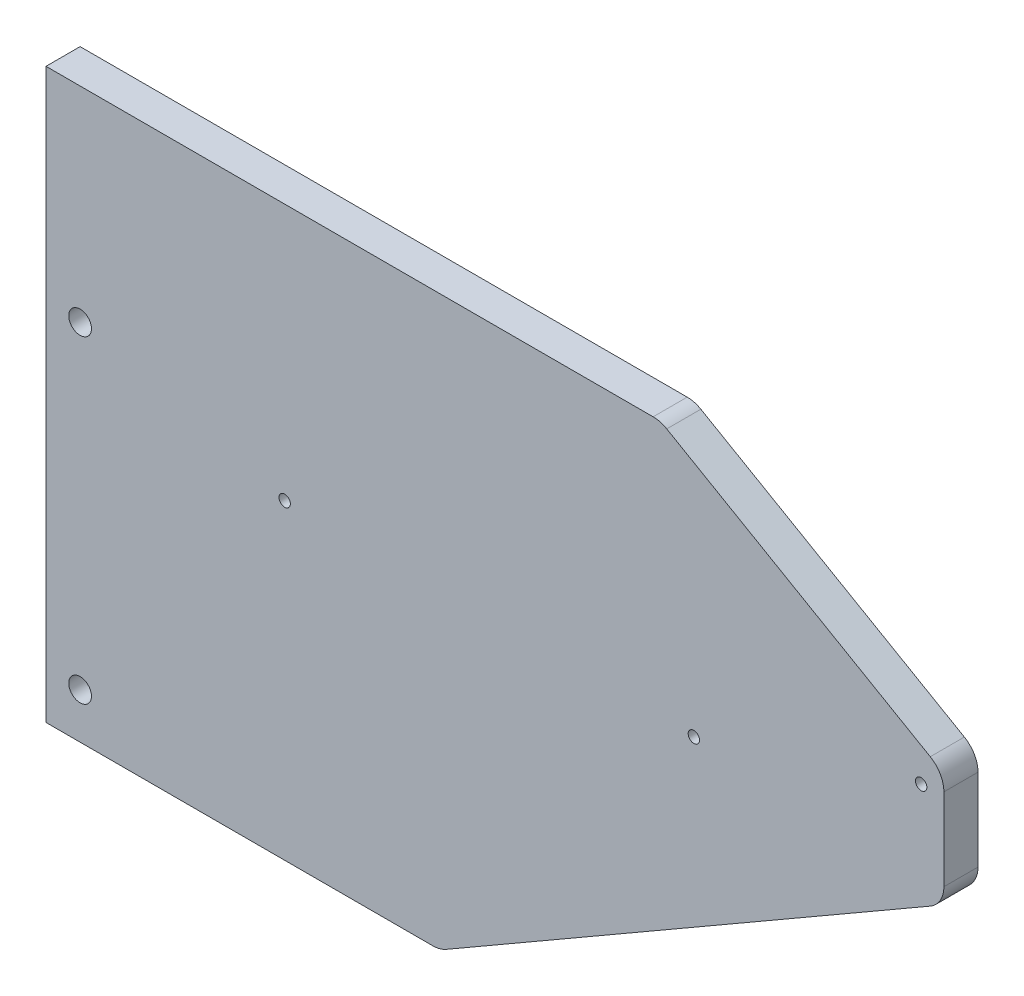
ISO-10303-21;
HEADER;
FILE_DESCRIPTION(('STEP AP214'),'2;1');
FILE_NAME('part.step','',(''),(''),'','','');
FILE_SCHEMA(('AUTOMOTIVE_DESIGN { 1 0 10303 214 1 1 1 1 }'));
ENDSEC;
DATA;
#1=APPLICATION_CONTEXT('core data for automotive mechanical design processes');
#2=APPLICATION_PROTOCOL_DEFINITION('international standard','automotive_design',2000,#1);
#3=PRODUCT_CONTEXT('',#1,'mechanical');
#4=PRODUCT('Part','Part','',(#3));
#5=PRODUCT_RELATED_PRODUCT_CATEGORY('part','',(#4));
#6=PRODUCT_DEFINITION_FORMATION('','',#4);
#7=PRODUCT_DEFINITION_CONTEXT('part definition',#1,'design');
#8=PRODUCT_DEFINITION('design','',#6,#7);
#9=PRODUCT_DEFINITION_SHAPE('','',#8);
#10=(LENGTH_UNIT() NAMED_UNIT(*) SI_UNIT(.MILLI.,.METRE.));
#11=(NAMED_UNIT(*) PLANE_ANGLE_UNIT() SI_UNIT($,.RADIAN.));
#12=(NAMED_UNIT(*) SI_UNIT($,.STERADIAN.) SOLID_ANGLE_UNIT());
#13=UNCERTAINTY_MEASURE_WITH_UNIT(LENGTH_MEASURE(1.E-05),#10,'distance_accuracy_value','');
#14=(GEOMETRIC_REPRESENTATION_CONTEXT(3) GLOBAL_UNCERTAINTY_ASSIGNED_CONTEXT((#13)) GLOBAL_UNIT_ASSIGNED_CONTEXT((#10,
#11,#12)) REPRESENTATION_CONTEXT('',''));
#15=CARTESIAN_POINT('',(0.,0.,0.));
#16=DIRECTION('',(0.,0.,1.));
#17=DIRECTION('',(1.,0.,0.));
#18=AXIS2_PLACEMENT_3D('',#15,#16,#17);
#19=CARTESIAN_POINT('',(7.9999999999999,-18.0717967697244,7.5));
#20=DIRECTION('',(0.,0.,-1.));
#21=DIRECTION('',(-1.,0.,0.));
#22=AXIS2_PLACEMENT_3D('',#19,#20,#21);
#23=PLANE('',#22);
#24=CARTESIAN_POINT('',(7.9999999999999,-18.0717967697244,7.5));
#25=DIRECTION('',(0.,0.,1.));
#26=DIRECTION('',(-1.,0.,0.));
#27=AXIS2_PLACEMENT_3D('',#24,#25,#26);
#28=CIRCLE('',#27,12.0000000000001);
#29=CARTESIAN_POINT('',(13.9999999999999,-28.4641016151378,7.5));
#30=VERTEX_POINT('',#29);
#31=CARTESIAN_POINT('',(20.,-18.0717967697244,7.5));
#32=VERTEX_POINT('',#31);
#33=EDGE_CURVE('E163',#30,#32,#28,.T.);
#34=ORIENTED_EDGE('',*,*,#33,.T.);
#35=DIRECTION('',(0.,1.,0.));
#36=VECTOR('',#35,1.);
#37=CARTESIAN_POINT('',(20.,-18.0717967697244,7.5));
#38=LINE('',#37,#36);
#39=CARTESIAN_POINT('',(20.,18.0717967697244,7.5));
#40=VERTEX_POINT('',#39);
#41=EDGE_CURVE('E101',#32,#40,#38,.T.);
#42=ORIENTED_EDGE('',*,*,#41,.T.);
#43=CARTESIAN_POINT('',(7.99999999999988,18.0717967697244,7.5));
#44=DIRECTION('',(0.,0.,1.));
#45=DIRECTION('',(-1.,0.,0.));
#46=AXIS2_PLACEMENT_3D('',#43,#44,#45);
#47=CIRCLE('',#46,12.0000000000001);
#48=CARTESIAN_POINT('',(13.9999999999999,28.4641016151378,7.5));
#49=VERTEX_POINT('',#48);
#50=EDGE_CURVE('E184',#40,#49,#47,.T.);
#51=ORIENTED_EDGE('',*,*,#50,.T.);
#52=DIRECTION('',(-0.866025403784442,0.499999999999995,0.));
#53=VECTOR('',#52,1.);
#54=CARTESIAN_POINT('',(-101.923048454134,95.3923048454132,7.5));
#55=LINE('',#54,#53);
#56=CARTESIAN_POINT('',(-101.923048454134,95.3923048454132,7.5));
#57=VERTEX_POINT('',#56);
#58=EDGE_CURVE('E203',#49,#57,#55,.T.);
#59=ORIENTED_EDGE('',*,*,#58,.T.);
#60=CARTESIAN_POINT('',(-107.923048454134,84.9999999999999,7.5));
#61=DIRECTION('',(0.,0.,1.));
#62=DIRECTION('',(-1.,0.,0.));
#63=AXIS2_PLACEMENT_3D('',#60,#61,#62);
#64=CIRCLE('',#63,12.0000000000001);
#65=CARTESIAN_POINT('',(-107.923048454134,96.9999999999999,7.5));
#66=VERTEX_POINT('',#65);
#67=EDGE_CURVE('E200',#57,#66,#64,.T.);
#68=ORIENTED_EDGE('',*,*,#67,.T.);
#69=DIRECTION('',(-1.,0.,0.));
#70=VECTOR('',#69,1.);
#71=CARTESIAN_POINT('',(-375.,96.9999999999999,7.5));
#72=LINE('',#71,#70);
#73=CARTESIAN_POINT('',(-375.,96.9999999999999,7.5));
#74=VERTEX_POINT('',#73);
#75=EDGE_CURVE('E202',#66,#74,#72,.T.);
#76=ORIENTED_EDGE('',*,*,#75,.T.);
#77=DIRECTION('',(0.,-1.,0.));
#78=VECTOR('',#77,1.);
#79=CARTESIAN_POINT('',(-375.,-153.,7.5));
#80=LINE('',#79,#78);
#81=CARTESIAN_POINT('',(-375.,-153.,7.5));
#82=VERTEX_POINT('',#81);
#83=EDGE_CURVE('E126',#74,#82,#80,.T.);
#84=ORIENTED_EDGE('',*,*,#83,.T.);
#85=DIRECTION('',(1.,0.,0.));
#86=VECTOR('',#85,1.);
#87=CARTESIAN_POINT('',(-204.917893677993,-153.,7.5));
#88=LINE('',#87,#86);
#89=CARTESIAN_POINT('',(-204.917893677993,-153.,7.5));
#90=VERTEX_POINT('',#89);
#91=EDGE_CURVE('E120',#82,#90,#88,.T.);
#92=ORIENTED_EDGE('',*,*,#91,.T.);
#93=CARTESIAN_POINT('',(-204.917893677993,-141.,7.5));
#94=DIRECTION('',(0.,0.,1.));
#95=DIRECTION('',(-1.,0.,0.));
#96=AXIS2_PLACEMENT_3D('',#93,#94,#95);
#97=CIRCLE('',#96,12.);
#98=CARTESIAN_POINT('',(-198.917893677993,-151.392304845413,7.5));
#99=VERTEX_POINT('',#98);
#100=EDGE_CURVE('E124',#90,#99,#97,.T.);
#101=ORIENTED_EDGE('',*,*,#100,.T.);
#102=DIRECTION('',(0.866025403784441,0.499999999999995,0.));
#103=VECTOR('',#102,1.);
#104=CARTESIAN_POINT('',(-198.917893677993,-151.392304845413,7.5));
#105=LINE('',#104,#103);
#106=EDGE_CURVE('E52',#99,#30,#105,.T.);
#107=ORIENTED_EDGE('',*,*,#106,.T.);
#108=EDGE_LOOP('',(#34,#42,#51,#59,#68,#76,#84,#92,#101,#107));
#109=FACE_BOUND('',#108,.T.);
#110=CARTESIAN_POINT('',(-360.,6.99999999999992,7.5));
#111=DIRECTION('',(0.,0.,1.));
#112=DIRECTION('',(1.,0.,0.));
#113=AXIS2_PLACEMENT_3D('',#110,#111,#112);
#114=CIRCLE('',#113,4.99999999999999);
#115=CARTESIAN_POINT('',(-355.,6.99999999999992,7.5));
#116=VERTEX_POINT('',#115);
#117=EDGE_CURVE('E148',#116,#116,#114,.T.);
#118=ORIENTED_EDGE('',*,*,#117,.F.);
#119=EDGE_LOOP('',(#118));
#120=FACE_BOUND('',#119,.T.);
#121=CARTESIAN_POINT('',(-360.,-133.,7.5));
#122=DIRECTION('',(0.,0.,1.));
#123=DIRECTION('',(1.,0.,0.));
#124=AXIS2_PLACEMENT_3D('',#121,#122,#123);
#125=CIRCLE('',#124,4.99999999999999);
#126=CARTESIAN_POINT('',(-355.,-133.,7.5));
#127=VERTEX_POINT('',#126);
#128=EDGE_CURVE('E214',#127,#127,#125,.T.);
#129=ORIENTED_EDGE('',*,*,#128,.F.);
#130=EDGE_LOOP('',(#129));
#131=FACE_BOUND('',#130,.T.);
#132=CARTESIAN_POINT('',(-270.,-16.,7.5));
#133=DIRECTION('',(0.,0.,1.));
#134=DIRECTION('',(1.,0.,0.));
#135=AXIS2_PLACEMENT_3D('',#132,#133,#134);
#136=CIRCLE('',#135,2.50000000000002);
#137=CARTESIAN_POINT('',(-267.5,-16.,7.5));
#138=VERTEX_POINT('',#137);
#139=EDGE_CURVE('E220',#138,#138,#136,.T.);
#140=ORIENTED_EDGE('',*,*,#139,.F.);
#141=EDGE_LOOP('',(#140));
#142=FACE_BOUND('',#141,.T.);
#143=CARTESIAN_POINT('',(-90.,-16.,7.5));
#144=DIRECTION('',(0.,0.,1.));
#145=DIRECTION('',(1.,0.,0.));
#146=AXIS2_PLACEMENT_3D('',#143,#144,#145);
#147=CIRCLE('',#146,2.5);
#148=CARTESIAN_POINT('',(-87.5,-16.,7.5));
#149=VERTEX_POINT('',#148);
#150=EDGE_CURVE('E226',#149,#149,#147,.T.);
#151=ORIENTED_EDGE('',*,*,#150,.F.);
#152=EDGE_LOOP('',(#151));
#153=FACE_BOUND('',#152,.T.);
#154=CARTESIAN_POINT('',(9.99999999999999,16.,7.5));
#155=DIRECTION('',(0.,0.,1.));
#156=DIRECTION('',(1.,0.,0.));
#157=AXIS2_PLACEMENT_3D('',#154,#155,#156);
#158=CIRCLE('',#157,2.5);
#159=CARTESIAN_POINT('',(12.5,16.,7.5));
#160=VERTEX_POINT('',#159);
#161=EDGE_CURVE('E232',#160,#160,#158,.T.);
#162=ORIENTED_EDGE('',*,*,#161,.F.);
#163=EDGE_LOOP('',(#162));
#164=FACE_BOUND('',#163,.T.);
#165=ADVANCED_FACE('F35',(#109,#120,#131,#142,#153,#164),#23,.F.);
#166=CARTESIAN_POINT('',(7.9999999999999,-18.0717967697244,-7.5));
#167=DIRECTION('',(0.,0.,-1.));
#168=DIRECTION('',(-1.,0.,0.));
#169=AXIS2_PLACEMENT_3D('',#166,#167,#168);
#170=PLANE('',#169);
#171=CARTESIAN_POINT('',(-90.,-16.,-7.5));
#172=DIRECTION('',(0.,0.,1.));
#173=DIRECTION('',(1.,0.,0.));
#174=AXIS2_PLACEMENT_3D('',#171,#172,#173);
#175=CIRCLE('',#174,2.5);
#176=CARTESIAN_POINT('',(-87.5,-16.,-7.5));
#177=VERTEX_POINT('',#176);
#178=EDGE_CURVE('E229',#177,#177,#175,.T.);
#179=ORIENTED_EDGE('',*,*,#178,.T.);
#180=EDGE_LOOP('',(#179));
#181=FACE_BOUND('',#180,.T.);
#182=CARTESIAN_POINT('',(-360.,-133.,-7.5));
#183=DIRECTION('',(0.,0.,1.));
#184=DIRECTION('',(1.,0.,0.));
#185=AXIS2_PLACEMENT_3D('',#182,#183,#184);
#186=CIRCLE('',#185,4.99999999999999);
#187=CARTESIAN_POINT('',(-355.,-133.,-7.5));
#188=VERTEX_POINT('',#187);
#189=EDGE_CURVE('E217',#188,#188,#186,.T.);
#190=ORIENTED_EDGE('',*,*,#189,.T.);
#191=EDGE_LOOP('',(#190));
#192=FACE_BOUND('',#191,.T.);
#193=CARTESIAN_POINT('',(7.9999999999999,-18.0717967697244,-7.5));
#194=DIRECTION('',(0.,0.,1.));
#195=DIRECTION('',(-1.,0.,0.));
#196=AXIS2_PLACEMENT_3D('',#193,#194,#195);
#197=CIRCLE('',#196,12.0000000000001);
#198=CARTESIAN_POINT('',(13.9999999999999,-28.4641016151378,-7.5));
#199=VERTEX_POINT('',#198);
#200=CARTESIAN_POINT('',(20.,-18.0717967697244,-7.5));
#201=VERTEX_POINT('',#200);
#202=EDGE_CURVE('E144',#199,#201,#197,.T.);
#203=ORIENTED_EDGE('',*,*,#202,.F.);
#204=DIRECTION('',(0.866025403784441,0.499999999999995,0.));
#205=VECTOR('',#204,1.);
#206=CARTESIAN_POINT('',(-198.917893677993,-151.392304845413,-7.5));
#207=LINE('',#206,#205);
#208=CARTESIAN_POINT('',(-198.917893677993,-151.392304845413,-7.5));
#209=VERTEX_POINT('',#208);
#210=EDGE_CURVE('E93',#209,#199,#207,.T.);
#211=ORIENTED_EDGE('',*,*,#210,.F.);
#212=CARTESIAN_POINT('',(-204.917893677993,-141.,-7.5));
#213=DIRECTION('',(0.,0.,1.));
#214=DIRECTION('',(-1.,0.,0.));
#215=AXIS2_PLACEMENT_3D('',#212,#213,#214);
#216=CIRCLE('',#215,12.);
#217=CARTESIAN_POINT('',(-204.917893677993,-153.,-7.5));
#218=VERTEX_POINT('',#217);
#219=EDGE_CURVE('E87',#218,#209,#216,.T.);
#220=ORIENTED_EDGE('',*,*,#219,.F.);
#221=DIRECTION('',(1.,0.,0.));
#222=VECTOR('',#221,1.);
#223=CARTESIAN_POINT('',(-204.917893677993,-153.,-7.5));
#224=LINE('',#223,#222);
#225=CARTESIAN_POINT('',(-375.,-153.,-7.5));
#226=VERTEX_POINT('',#225);
#227=EDGE_CURVE('E134',#226,#218,#224,.T.);
#228=ORIENTED_EDGE('',*,*,#227,.F.);
#229=DIRECTION('',(0.,-1.,0.));
#230=VECTOR('',#229,1.);
#231=CARTESIAN_POINT('',(-375.,-153.,-7.5));
#232=LINE('',#231,#230);
#233=CARTESIAN_POINT('',(-375.,96.9999999999999,-7.5));
#234=VERTEX_POINT('',#233);
#235=EDGE_CURVE('E158',#234,#226,#232,.T.);
#236=ORIENTED_EDGE('',*,*,#235,.F.);
#237=DIRECTION('',(-1.,0.,0.));
#238=VECTOR('',#237,1.);
#239=CARTESIAN_POINT('',(-375.,96.9999999999999,-7.5));
#240=LINE('',#239,#238);
#241=CARTESIAN_POINT('',(-107.923048454134,96.9999999999999,-7.5));
#242=VERTEX_POINT('',#241);
#243=EDGE_CURVE('E156',#242,#234,#240,.T.);
#244=ORIENTED_EDGE('',*,*,#243,.F.);
#245=CARTESIAN_POINT('',(-107.923048454134,84.9999999999999,-7.5));
#246=DIRECTION('',(0.,0.,1.));
#247=DIRECTION('',(-1.,0.,0.));
#248=AXIS2_PLACEMENT_3D('',#245,#246,#247);
#249=CIRCLE('',#248,12.0000000000001);
#250=CARTESIAN_POINT('',(-101.923048454134,95.3923048454132,-7.5));
#251=VERTEX_POINT('',#250);
#252=EDGE_CURVE('E154',#251,#242,#249,.T.);
#253=ORIENTED_EDGE('',*,*,#252,.F.);
#254=DIRECTION('',(-0.866025403784442,0.499999999999995,0.));
#255=VECTOR('',#254,1.);
#256=CARTESIAN_POINT('',(-101.923048454134,95.3923048454132,-7.5));
#257=LINE('',#256,#255);
#258=CARTESIAN_POINT('',(13.9999999999999,28.4641016151378,-7.5));
#259=VERTEX_POINT('',#258);
#260=EDGE_CURVE('E152',#259,#251,#257,.T.);
#261=ORIENTED_EDGE('',*,*,#260,.F.);
#262=CARTESIAN_POINT('',(7.99999999999988,18.0717967697244,-7.5));
#263=DIRECTION('',(0.,0.,1.));
#264=DIRECTION('',(-1.,0.,0.));
#265=AXIS2_PLACEMENT_3D('',#262,#263,#264);
#266=CIRCLE('',#265,12.0000000000001);
#267=CARTESIAN_POINT('',(20.,18.0717967697244,-7.5));
#268=VERTEX_POINT('',#267);
#269=EDGE_CURVE('E150',#268,#259,#266,.T.);
#270=ORIENTED_EDGE('',*,*,#269,.F.);
#271=DIRECTION('',(0.,1.,0.));
#272=VECTOR('',#271,1.);
#273=CARTESIAN_POINT('',(20.,18.0717967697244,-7.5));
#274=LINE('',#273,#272);
#275=EDGE_CURVE('E147',#201,#268,#274,.T.);
#276=ORIENTED_EDGE('',*,*,#275,.F.);
#277=EDGE_LOOP('',(#203,#211,#220,#228,#236,#244,#253,#261,#270,#276));
#278=FACE_BOUND('',#277,.T.);
#279=CARTESIAN_POINT('',(-360.,6.99999999999992,-7.5));
#280=DIRECTION('',(0.,0.,1.));
#281=DIRECTION('',(1.,0.,0.));
#282=AXIS2_PLACEMENT_3D('',#279,#280,#281);
#283=CIRCLE('',#282,4.99999999999999);
#284=CARTESIAN_POINT('',(-355.,6.99999999999992,-7.5));
#285=VERTEX_POINT('',#284);
#286=EDGE_CURVE('E211',#285,#285,#283,.T.);
#287=ORIENTED_EDGE('',*,*,#286,.T.);
#288=EDGE_LOOP('',(#287));
#289=FACE_BOUND('',#288,.T.);
#290=CARTESIAN_POINT('',(-270.,-16.,-7.5));
#291=DIRECTION('',(0.,0.,1.));
#292=DIRECTION('',(1.,0.,0.));
#293=AXIS2_PLACEMENT_3D('',#290,#291,#292);
#294=CIRCLE('',#293,2.50000000000002);
#295=CARTESIAN_POINT('',(-267.5,-16.,-7.5));
#296=VERTEX_POINT('',#295);
#297=EDGE_CURVE('E223',#296,#296,#294,.T.);
#298=ORIENTED_EDGE('',*,*,#297,.T.);
#299=EDGE_LOOP('',(#298));
#300=FACE_BOUND('',#299,.T.);
#301=CARTESIAN_POINT('',(9.99999999999999,16.,-7.5));
#302=DIRECTION('',(0.,0.,1.));
#303=DIRECTION('',(1.,0.,0.));
#304=AXIS2_PLACEMENT_3D('',#301,#302,#303);
#305=CIRCLE('',#304,2.5);
#306=CARTESIAN_POINT('',(12.5,16.,-7.5));
#307=VERTEX_POINT('',#306);
#308=EDGE_CURVE('E235',#307,#307,#305,.T.);
#309=ORIENTED_EDGE('',*,*,#308,.T.);
#310=EDGE_LOOP('',(#309));
#311=FACE_BOUND('',#310,.T.);
#312=ADVANCED_FACE('F188',(#181,#192,#278,#289,#300,#311),#170,.T.);
#313=CARTESIAN_POINT('',(7.9999999999999,-18.0717967697244,7.5));
#314=DIRECTION('',(0.,0.,-1.));
#315=DIRECTION('',(-1.,0.,0.));
#316=AXIS2_PLACEMENT_3D('',#313,#314,#315);
#317=CYLINDRICAL_SURFACE('',#316,12.0000000000001);
#318=ORIENTED_EDGE('',*,*,#202,.T.);
#319=DIRECTION('',(0.,0.,-1.));
#320=VECTOR('',#319,1.);
#321=CARTESIAN_POINT('',(20.,-18.0717967697244,7.5));
#322=LINE('',#321,#320);
#323=EDGE_CURVE('E11',#32,#201,#322,.T.);
#324=ORIENTED_EDGE('',*,*,#323,.F.);
#325=ORIENTED_EDGE('',*,*,#33,.F.);
#326=DIRECTION('',(0.,0.,-1.));
#327=VECTOR('',#326,1.);
#328=CARTESIAN_POINT('',(13.9999999999999,-28.4641016151378,7.5));
#329=LINE('',#328,#327);
#330=EDGE_CURVE('E140',#30,#199,#329,.T.);
#331=ORIENTED_EDGE('',*,*,#330,.T.);
#332=EDGE_LOOP('',(#318,#324,#325,#331));
#333=FACE_BOUND('',#332,.T.);
#334=ADVANCED_FACE('F37',(#333),#317,.T.);
#335=CARTESIAN_POINT('',(20.,18.0717967697244,7.5));
#336=DIRECTION('',(-1.,0.,0.));
#337=DIRECTION('',(0.,-1.,0.));
#338=AXIS2_PLACEMENT_3D('',#335,#336,#337);
#339=PLANE('',#338);
#340=ORIENTED_EDGE('',*,*,#275,.T.);
#341=DIRECTION('',(0.,0.,-1.));
#342=VECTOR('',#341,1.);
#343=CARTESIAN_POINT('',(20.,18.0717967697244,7.5));
#344=LINE('',#343,#342);
#345=EDGE_CURVE('E44',#40,#268,#344,.T.);
#346=ORIENTED_EDGE('',*,*,#345,.F.);
#347=ORIENTED_EDGE('',*,*,#41,.F.);
#348=ORIENTED_EDGE('',*,*,#323,.T.);
#349=EDGE_LOOP('',(#340,#346,#347,#348));
#350=FACE_BOUND('',#349,.T.);
#351=ADVANCED_FACE('F275',(#350),#339,.F.);
#352=CARTESIAN_POINT('',(7.99999999999988,18.0717967697244,7.5));
#353=DIRECTION('',(0.,0.,-1.));
#354=DIRECTION('',(-1.,0.,0.));
#355=AXIS2_PLACEMENT_3D('',#352,#353,#354);
#356=CYLINDRICAL_SURFACE('',#355,12.0000000000001);
#357=ORIENTED_EDGE('',*,*,#269,.T.);
#358=DIRECTION('',(0.,0.,-1.));
#359=VECTOR('',#358,1.);
#360=CARTESIAN_POINT('',(13.9999999999999,28.4641016151378,7.5));
#361=LINE('',#360,#359);
#362=EDGE_CURVE('E176',#49,#259,#361,.T.);
#363=ORIENTED_EDGE('',*,*,#362,.F.);
#364=ORIENTED_EDGE('',*,*,#50,.F.);
#365=ORIENTED_EDGE('',*,*,#345,.T.);
#366=EDGE_LOOP('',(#357,#363,#364,#365));
#367=FACE_BOUND('',#366,.T.);
#368=ADVANCED_FACE('F182',(#367),#356,.T.);
#369=CARTESIAN_POINT('',(-101.923048454134,95.3923048454132,7.5));
#370=DIRECTION('',(-0.499999999999995,-0.866025403784442,0.));
#371=DIRECTION('',(0.866025403784442,-0.499999999999995,0.));
#372=AXIS2_PLACEMENT_3D('',#369,#370,#371);
#373=PLANE('',#372);
#374=ORIENTED_EDGE('',*,*,#260,.T.);
#375=DIRECTION('',(0.,0.,-1.));
#376=VECTOR('',#375,1.);
#377=CARTESIAN_POINT('',(-101.923048454134,95.3923048454132,7.5));
#378=LINE('',#377,#376);
#379=EDGE_CURVE('E173',#57,#251,#378,.T.);
#380=ORIENTED_EDGE('',*,*,#379,.F.);
#381=ORIENTED_EDGE('',*,*,#58,.F.);
#382=ORIENTED_EDGE('',*,*,#362,.T.);
#383=EDGE_LOOP('',(#374,#380,#381,#382));
#384=FACE_BOUND('',#383,.T.);
#385=ADVANCED_FACE('F194',(#384),#373,.F.);
#386=CARTESIAN_POINT('',(-107.923048454134,84.9999999999999,7.5));
#387=DIRECTION('',(0.,0.,-1.));
#388=DIRECTION('',(-1.,0.,0.));
#389=AXIS2_PLACEMENT_3D('',#386,#387,#388);
#390=CYLINDRICAL_SURFACE('',#389,12.0000000000001);
#391=ORIENTED_EDGE('',*,*,#252,.T.);
#392=DIRECTION('',(0.,0.,-1.));
#393=VECTOR('',#392,1.);
#394=CARTESIAN_POINT('',(-107.923048454134,96.9999999999999,7.5));
#395=LINE('',#394,#393);
#396=EDGE_CURVE('E170',#66,#242,#395,.T.);
#397=ORIENTED_EDGE('',*,*,#396,.F.);
#398=ORIENTED_EDGE('',*,*,#67,.F.);
#399=ORIENTED_EDGE('',*,*,#379,.T.);
#400=EDGE_LOOP('',(#391,#397,#398,#399));
#401=FACE_BOUND('',#400,.T.);
#402=ADVANCED_FACE('F198',(#401),#390,.T.);
#403=CARTESIAN_POINT('',(-375.,96.9999999999999,7.5));
#404=DIRECTION('',(0.,-1.,0.));
#405=DIRECTION('',(1.,0.,0.));
#406=AXIS2_PLACEMENT_3D('',#403,#404,#405);
#407=PLANE('',#406);
#408=ORIENTED_EDGE('',*,*,#243,.T.);
#409=DIRECTION('',(0.,0.,-1.));
#410=VECTOR('',#409,1.);
#411=CARTESIAN_POINT('',(-375.,96.9999999999999,7.5));
#412=LINE('',#411,#410);
#413=EDGE_CURVE('E167',#74,#234,#412,.T.);
#414=ORIENTED_EDGE('',*,*,#413,.F.);
#415=ORIENTED_EDGE('',*,*,#75,.F.);
#416=ORIENTED_EDGE('',*,*,#396,.T.);
#417=EDGE_LOOP('',(#408,#414,#415,#416));
#418=FACE_BOUND('',#417,.T.);
#419=ADVANCED_FACE('F265',(#418),#407,.F.);
#420=CARTESIAN_POINT('',(-375.,-153.,7.5));
#421=DIRECTION('',(1.,0.,0.));
#422=DIRECTION('',(0.,0.,-1.));
#423=AXIS2_PLACEMENT_3D('',#420,#421,#422);
#424=PLANE('',#423);
#425=ORIENTED_EDGE('',*,*,#235,.T.);
#426=DIRECTION('',(0.,0.,-1.));
#427=VECTOR('',#426,1.);
#428=CARTESIAN_POINT('',(-375.,-153.,7.5));
#429=LINE('',#428,#427);
#430=EDGE_CURVE('E135',#82,#226,#429,.T.);
#431=ORIENTED_EDGE('',*,*,#430,.F.);
#432=ORIENTED_EDGE('',*,*,#83,.F.);
#433=ORIENTED_EDGE('',*,*,#413,.T.);
#434=EDGE_LOOP('',(#425,#431,#432,#433));
#435=FACE_BOUND('',#434,.T.);
#436=ADVANCED_FACE('F262',(#435),#424,.F.);
#437=CARTESIAN_POINT('',(-204.917893677993,-153.,7.5));
#438=DIRECTION('',(0.,1.,0.));
#439=DIRECTION('',(-1.,0.,0.));
#440=AXIS2_PLACEMENT_3D('',#437,#438,#439);
#441=PLANE('',#440);
#442=ORIENTED_EDGE('',*,*,#227,.T.);
#443=DIRECTION('',(0.,0.,-1.));
#444=VECTOR('',#443,1.);
#445=CARTESIAN_POINT('',(-204.917893677993,-153.,7.5));
#446=LINE('',#445,#444);
#447=EDGE_CURVE('E131',#90,#218,#446,.T.);
#448=ORIENTED_EDGE('',*,*,#447,.F.);
#449=ORIENTED_EDGE('',*,*,#91,.F.);
#450=ORIENTED_EDGE('',*,*,#430,.T.);
#451=EDGE_LOOP('',(#442,#448,#449,#450));
#452=FACE_BOUND('',#451,.T.);
#453=ADVANCED_FACE('F132',(#452),#441,.F.);
#454=CARTESIAN_POINT('',(-204.917893677993,-141.,7.5));
#455=DIRECTION('',(0.,0.,-1.));
#456=DIRECTION('',(-1.,0.,0.));
#457=AXIS2_PLACEMENT_3D('',#454,#455,#456);
#458=CYLINDRICAL_SURFACE('',#457,12.);
#459=ORIENTED_EDGE('',*,*,#219,.T.);
#460=DIRECTION('',(0.,0.,-1.));
#461=VECTOR('',#460,1.);
#462=CARTESIAN_POINT('',(-198.917893677993,-151.392304845413,7.5));
#463=LINE('',#462,#461);
#464=EDGE_CURVE('E136',#99,#209,#463,.T.);
#465=ORIENTED_EDGE('',*,*,#464,.F.);
#466=ORIENTED_EDGE('',*,*,#100,.F.);
#467=ORIENTED_EDGE('',*,*,#447,.T.);
#468=EDGE_LOOP('',(#459,#465,#466,#467));
#469=FACE_BOUND('',#468,.T.);
#470=ADVANCED_FACE('F138',(#469),#458,.T.);
#471=CARTESIAN_POINT('',(-198.917893677993,-151.392304845413,7.5));
#472=DIRECTION('',(-0.499999999999995,0.866025403784441,0.));
#473=DIRECTION('',(-0.866025403784441,-0.499999999999995,0.));
#474=AXIS2_PLACEMENT_3D('',#471,#472,#473);
#475=PLANE('',#474);
#476=ORIENTED_EDGE('',*,*,#210,.T.);
#477=ORIENTED_EDGE('',*,*,#330,.F.);
#478=ORIENTED_EDGE('',*,*,#106,.F.);
#479=ORIENTED_EDGE('',*,*,#464,.T.);
#480=EDGE_LOOP('',(#476,#477,#478,#479));
#481=FACE_BOUND('',#480,.T.);
#482=ADVANCED_FACE('F255',(#481),#475,.F.);
#483=CARTESIAN_POINT('',(-360.,6.99999999999992,7.5));
#484=DIRECTION('',(0.,0.,-1.));
#485=DIRECTION('',(-1.,0.,0.));
#486=AXIS2_PLACEMENT_3D('',#483,#484,#485);
#487=CYLINDRICAL_SURFACE('',#486,4.99999999999999);
#488=ORIENTED_EDGE('',*,*,#117,.T.);
#489=EDGE_LOOP('',(#488));
#490=FACE_BOUND('',#489,.T.);
#491=ORIENTED_EDGE('',*,*,#286,.F.);
#492=EDGE_LOOP('',(#491));
#493=FACE_BOUND('',#492,.T.);
#494=ADVANCED_FACE('F252',(#490,#493),#487,.F.);
#495=CARTESIAN_POINT('',(-360.,-133.,7.5));
#496=DIRECTION('',(0.,0.,-1.));
#497=DIRECTION('',(-1.,0.,0.));
#498=AXIS2_PLACEMENT_3D('',#495,#496,#497);
#499=CYLINDRICAL_SURFACE('',#498,4.99999999999999);
#500=ORIENTED_EDGE('',*,*,#128,.T.);
#501=EDGE_LOOP('',(#500));
#502=FACE_BOUND('',#501,.T.);
#503=ORIENTED_EDGE('',*,*,#189,.F.);
#504=EDGE_LOOP('',(#503));
#505=FACE_BOUND('',#504,.T.);
#506=ADVANCED_FACE('F354',(#502,#505),#499,.F.);
#507=CARTESIAN_POINT('',(-270.,-16.,7.5));
#508=DIRECTION('',(0.,0.,-1.));
#509=DIRECTION('',(-1.,0.,0.));
#510=AXIS2_PLACEMENT_3D('',#507,#508,#509);
#511=CYLINDRICAL_SURFACE('',#510,2.50000000000002);
#512=ORIENTED_EDGE('',*,*,#139,.T.);
#513=EDGE_LOOP('',(#512));
#514=FACE_BOUND('',#513,.T.);
#515=ORIENTED_EDGE('',*,*,#297,.F.);
#516=EDGE_LOOP('',(#515));
#517=FACE_BOUND('',#516,.T.);
#518=ADVANCED_FACE('F362',(#514,#517),#511,.F.);
#519=CARTESIAN_POINT('',(-90.,-16.,7.5));
#520=DIRECTION('',(0.,0.,-1.));
#521=DIRECTION('',(-1.,0.,0.));
#522=AXIS2_PLACEMENT_3D('',#519,#520,#521);
#523=CYLINDRICAL_SURFACE('',#522,2.5);
#524=ORIENTED_EDGE('',*,*,#150,.T.);
#525=EDGE_LOOP('',(#524));
#526=FACE_BOUND('',#525,.T.);
#527=ORIENTED_EDGE('',*,*,#178,.F.);
#528=EDGE_LOOP('',(#527));
#529=FACE_BOUND('',#528,.T.);
#530=ADVANCED_FACE('F370',(#526,#529),#523,.F.);
#531=CARTESIAN_POINT('',(9.99999999999999,16.,7.5));
#532=DIRECTION('',(0.,0.,-1.));
#533=DIRECTION('',(-1.,0.,0.));
#534=AXIS2_PLACEMENT_3D('',#531,#532,#533);
#535=CYLINDRICAL_SURFACE('',#534,2.5);
#536=ORIENTED_EDGE('',*,*,#161,.T.);
#537=EDGE_LOOP('',(#536));
#538=FACE_BOUND('',#537,.T.);
#539=ORIENTED_EDGE('',*,*,#308,.F.);
#540=EDGE_LOOP('',(#539));
#541=FACE_BOUND('',#540,.T.);
#542=ADVANCED_FACE('F241',(#538,#541),#535,.F.);
#543=CLOSED_SHELL('',(#165,#312,#334,#351,#368,#385,#402,#419,#436,#453,#470,#482,#494,#506,
#518,#530,#542));
#544=MANIFOLD_SOLID_BREP('B2',#543);
#545=ADVANCED_BREP_SHAPE_REPRESENTATION('',(#18,#544),#14);
#546=SHAPE_DEFINITION_REPRESENTATION(#9,#545);
ENDSEC;
END-ISO-10303-21;
